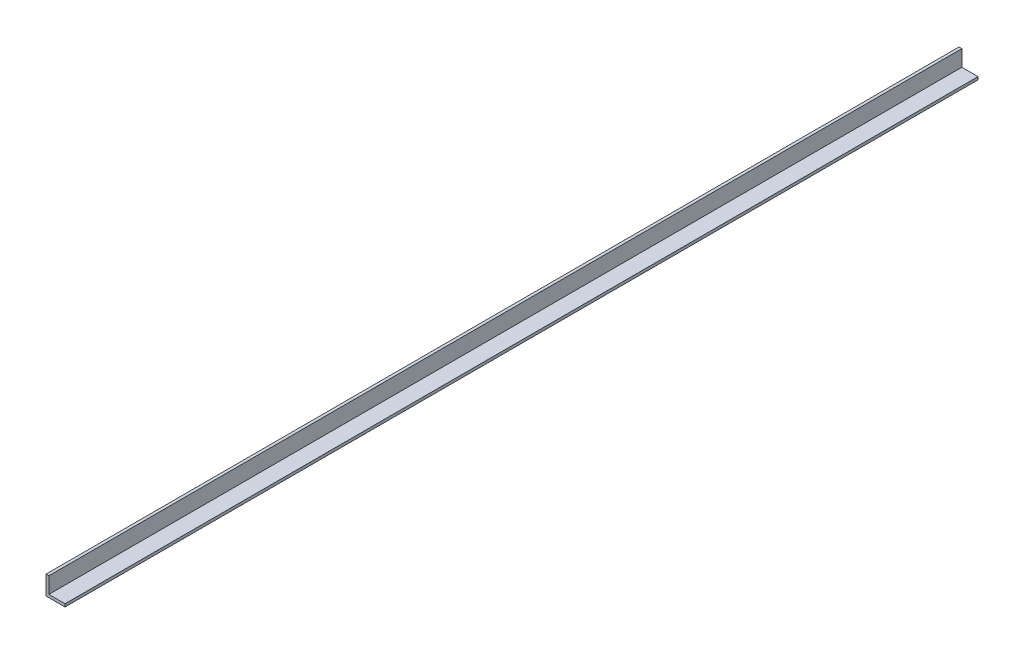
ISO-10303-21;
HEADER;
FILE_DESCRIPTION(('STEP AP214'),'2;1');
FILE_NAME('part.step','',(''),(''),'','','');
FILE_SCHEMA(('AUTOMOTIVE_DESIGN { 1 0 10303 214 1 1 1 1 }'));
ENDSEC;
DATA;
#1=APPLICATION_CONTEXT('core data for automotive mechanical design processes');
#2=APPLICATION_PROTOCOL_DEFINITION('international standard','automotive_design',2000,#1);
#3=PRODUCT_CONTEXT('',#1,'mechanical');
#4=PRODUCT('Part','Part','',(#3));
#5=PRODUCT_RELATED_PRODUCT_CATEGORY('part','',(#4));
#6=PRODUCT_DEFINITION_FORMATION('','',#4);
#7=PRODUCT_DEFINITION_CONTEXT('part definition',#1,'design');
#8=PRODUCT_DEFINITION('design','',#6,#7);
#9=PRODUCT_DEFINITION_SHAPE('','',#8);
#10=(LENGTH_UNIT() NAMED_UNIT(*) SI_UNIT(.MILLI.,.METRE.));
#11=(NAMED_UNIT(*) PLANE_ANGLE_UNIT() SI_UNIT($,.RADIAN.));
#12=(NAMED_UNIT(*) SI_UNIT($,.STERADIAN.) SOLID_ANGLE_UNIT());
#13=UNCERTAINTY_MEASURE_WITH_UNIT(LENGTH_MEASURE(1.E-05),#10,'distance_accuracy_value','');
#14=(GEOMETRIC_REPRESENTATION_CONTEXT(3) GLOBAL_UNCERTAINTY_ASSIGNED_CONTEXT((#13)) GLOBAL_UNIT_ASSIGNED_CONTEXT((#10,
#11,#12)) REPRESENTATION_CONTEXT('',''));
#15=CARTESIAN_POINT('',(0.,0.,0.));
#16=DIRECTION('',(0.,0.,1.));
#17=DIRECTION('',(1.,0.,0.));
#18=AXIS2_PLACEMENT_3D('',#15,#16,#17);
#19=CARTESIAN_POINT('',(19.05,127.,-6100.));
#20=DIRECTION('',(0.,1.,0.));
#21=DIRECTION('',(0.,0.,1.));
#22=AXIS2_PLACEMENT_3D('',#19,#20,#21);
#23=PLANE('',#22);
#24=DIRECTION('',(-1.,0.,0.));
#25=VECTOR('',#24,1.);
#26=CARTESIAN_POINT('',(19.05,127.,0.));
#27=LINE('',#26,#25);
#28=CARTESIAN_POINT('',(19.05,127.,0.));
#29=VERTEX_POINT('',#28);
#30=CARTESIAN_POINT('',(0.,127.,0.));
#31=VERTEX_POINT('',#30);
#32=EDGE_CURVE('E118',#29,#31,#27,.T.);
#33=ORIENTED_EDGE('',*,*,#32,.F.);
#34=DIRECTION('',(0.,0.,1.));
#35=VECTOR('',#34,1.);
#36=CARTESIAN_POINT('',(19.05,127.,-6100.));
#37=LINE('',#36,#35);
#38=CARTESIAN_POINT('',(19.05,127.,-6100.));
#39=VERTEX_POINT('',#38);
#40=EDGE_CURVE('E11',#39,#29,#37,.T.);
#41=ORIENTED_EDGE('',*,*,#40,.F.);
#42=DIRECTION('',(-1.,0.,0.));
#43=VECTOR('',#42,1.);
#44=CARTESIAN_POINT('',(19.05,127.,-6100.));
#45=LINE('',#44,#43);
#46=CARTESIAN_POINT('',(0.,127.,-6100.));
#47=VERTEX_POINT('',#46);
#48=EDGE_CURVE('E132',#39,#47,#45,.T.);
#49=ORIENTED_EDGE('',*,*,#48,.T.);
#50=DIRECTION('',(0.,0.,1.));
#51=VECTOR('',#50,1.);
#52=CARTESIAN_POINT('',(0.,127.,-6100.));
#53=LINE('',#52,#51);
#54=EDGE_CURVE('E36',#47,#31,#53,.T.);
#55=ORIENTED_EDGE('',*,*,#54,.T.);
#56=EDGE_LOOP('',(#33,#41,#49,#55));
#57=FACE_BOUND('',#56,.T.);
#58=ADVANCED_FACE('F33',(#57),#23,.T.);
#59=CARTESIAN_POINT('',(19.05,19.05,-6100.));
#60=DIRECTION('',(1.,0.,0.));
#61=DIRECTION('',(0.,0.,-1.));
#62=AXIS2_PLACEMENT_3D('',#59,#60,#61);
#63=PLANE('',#62);
#64=DIRECTION('',(0.,1.,0.));
#65=VECTOR('',#64,1.);
#66=CARTESIAN_POINT('',(19.05,19.05,0.));
#67=LINE('',#66,#65);
#68=CARTESIAN_POINT('',(19.05,19.05,0.));
#69=VERTEX_POINT('',#68);
#70=EDGE_CURVE('E130',#69,#29,#67,.T.);
#71=ORIENTED_EDGE('',*,*,#70,.F.);
#72=DIRECTION('',(0.,0.,1.));
#73=VECTOR('',#72,1.);
#74=CARTESIAN_POINT('',(19.05,19.05,-6100.));
#75=LINE('',#74,#73);
#76=CARTESIAN_POINT('',(19.05,19.05,-6100.));
#77=VERTEX_POINT('',#76);
#78=EDGE_CURVE('E42',#77,#69,#75,.T.);
#79=ORIENTED_EDGE('',*,*,#78,.F.);
#80=DIRECTION('',(0.,1.,0.));
#81=VECTOR('',#80,1.);
#82=CARTESIAN_POINT('',(19.05,19.05,-6100.));
#83=LINE('',#82,#81);
#84=EDGE_CURVE('E108',#77,#39,#83,.T.);
#85=ORIENTED_EDGE('',*,*,#84,.T.);
#86=ORIENTED_EDGE('',*,*,#40,.T.);
#87=EDGE_LOOP('',(#71,#79,#85,#86));
#88=FACE_BOUND('',#87,.T.);
#89=ADVANCED_FACE('F140',(#88),#63,.T.);
#90=CARTESIAN_POINT('',(127.,19.05,-6100.));
#91=DIRECTION('',(0.,1.,0.));
#92=DIRECTION('',(-1.,0.,0.));
#93=AXIS2_PLACEMENT_3D('',#90,#91,#92);
#94=PLANE('',#93);
#95=DIRECTION('',(-1.,0.,0.));
#96=VECTOR('',#95,1.);
#97=CARTESIAN_POINT('',(127.,19.05,0.));
#98=LINE('',#97,#96);
#99=CARTESIAN_POINT('',(127.,19.05,0.));
#100=VERTEX_POINT('',#99);
#101=EDGE_CURVE('E95',#100,#69,#98,.T.);
#102=ORIENTED_EDGE('',*,*,#101,.F.);
#103=DIRECTION('',(0.,0.,1.));
#104=VECTOR('',#103,1.);
#105=CARTESIAN_POINT('',(127.,19.05,-6100.));
#106=LINE('',#105,#104);
#107=CARTESIAN_POINT('',(127.,19.05,-6100.));
#108=VERTEX_POINT('',#107);
#109=EDGE_CURVE('E90',#108,#100,#106,.T.);
#110=ORIENTED_EDGE('',*,*,#109,.F.);
#111=DIRECTION('',(-1.,0.,0.));
#112=VECTOR('',#111,1.);
#113=CARTESIAN_POINT('',(127.,19.05,-6100.));
#114=LINE('',#113,#112);
#115=EDGE_CURVE('E93',#108,#77,#114,.T.);
#116=ORIENTED_EDGE('',*,*,#115,.T.);
#117=ORIENTED_EDGE('',*,*,#78,.T.);
#118=EDGE_LOOP('',(#102,#110,#116,#117));
#119=FACE_BOUND('',#118,.T.);
#120=ADVANCED_FACE('F92',(#119),#94,.T.);
#121=CARTESIAN_POINT('',(127.,0.,-6100.));
#122=DIRECTION('',(1.,0.,0.));
#123=DIRECTION('',(0.,0.,-1.));
#124=AXIS2_PLACEMENT_3D('',#121,#122,#123);
#125=PLANE('',#124);
#126=DIRECTION('',(0.,1.,0.));
#127=VECTOR('',#126,1.);
#128=CARTESIAN_POINT('',(127.,0.,0.));
#129=LINE('',#128,#127);
#130=CARTESIAN_POINT('',(127.,0.,0.));
#131=VERTEX_POINT('',#130);
#132=EDGE_CURVE('E127',#131,#100,#129,.T.);
#133=ORIENTED_EDGE('',*,*,#132,.F.);
#134=DIRECTION('',(0.,0.,1.));
#135=VECTOR('',#134,1.);
#136=CARTESIAN_POINT('',(127.,0.,-6100.));
#137=LINE('',#136,#135);
#138=CARTESIAN_POINT('',(127.,0.,-6100.));
#139=VERTEX_POINT('',#138);
#140=EDGE_CURVE('E100',#139,#131,#137,.T.);
#141=ORIENTED_EDGE('',*,*,#140,.F.);
#142=DIRECTION('',(0.,1.,0.));
#143=VECTOR('',#142,1.);
#144=CARTESIAN_POINT('',(127.,0.,-6100.));
#145=LINE('',#144,#143);
#146=EDGE_CURVE('E106',#139,#108,#145,.T.);
#147=ORIENTED_EDGE('',*,*,#146,.T.);
#148=ORIENTED_EDGE('',*,*,#109,.T.);
#149=EDGE_LOOP('',(#133,#141,#147,#148));
#150=FACE_BOUND('',#149,.T.);
#151=ADVANCED_FACE('F110',(#150),#125,.T.);
#152=CARTESIAN_POINT('',(0.,0.,-6100.));
#153=DIRECTION('',(0.,-1.,0.));
#154=DIRECTION('',(0.,0.,-1.));
#155=AXIS2_PLACEMENT_3D('',#152,#153,#154);
#156=PLANE('',#155);
#157=DIRECTION('',(1.,0.,0.));
#158=VECTOR('',#157,1.);
#159=CARTESIAN_POINT('',(0.,0.,0.));
#160=LINE('',#159,#158);
#161=CARTESIAN_POINT('',(0.,0.,0.));
#162=VERTEX_POINT('',#161);
#163=EDGE_CURVE('E124',#162,#131,#160,.T.);
#164=ORIENTED_EDGE('',*,*,#163,.F.);
#165=DIRECTION('',(0.,0.,1.));
#166=VECTOR('',#165,1.);
#167=CARTESIAN_POINT('',(0.,0.,-6100.));
#168=LINE('',#167,#166);
#169=CARTESIAN_POINT('',(0.,0.,-6100.));
#170=VERTEX_POINT('',#169);
#171=EDGE_CURVE('E135',#170,#162,#168,.T.);
#172=ORIENTED_EDGE('',*,*,#171,.F.);
#173=DIRECTION('',(1.,0.,0.));
#174=VECTOR('',#173,1.);
#175=CARTESIAN_POINT('',(0.,0.,-6100.));
#176=LINE('',#175,#174);
#177=EDGE_CURVE('E111',#170,#139,#176,.T.);
#178=ORIENTED_EDGE('',*,*,#177,.T.);
#179=ORIENTED_EDGE('',*,*,#140,.T.);
#180=EDGE_LOOP('',(#164,#172,#178,#179));
#181=FACE_BOUND('',#180,.T.);
#182=ADVANCED_FACE('F153',(#181),#156,.T.);
#183=CARTESIAN_POINT('',(0.,127.,-6100.));
#184=DIRECTION('',(-1.,0.,0.));
#185=DIRECTION('',(0.,-1.,0.));
#186=AXIS2_PLACEMENT_3D('',#183,#184,#185);
#187=PLANE('',#186);
#188=DIRECTION('',(0.,-1.,0.));
#189=VECTOR('',#188,1.);
#190=CARTESIAN_POINT('',(0.,127.,0.));
#191=LINE('',#190,#189);
#192=EDGE_CURVE('E121',#31,#162,#191,.T.);
#193=ORIENTED_EDGE('',*,*,#192,.F.);
#194=ORIENTED_EDGE('',*,*,#54,.F.);
#195=DIRECTION('',(0.,-1.,0.));
#196=VECTOR('',#195,1.);
#197=CARTESIAN_POINT('',(0.,127.,-6100.));
#198=LINE('',#197,#196);
#199=EDGE_CURVE('E113',#47,#170,#198,.T.);
#200=ORIENTED_EDGE('',*,*,#199,.T.);
#201=ORIENTED_EDGE('',*,*,#171,.T.);
#202=EDGE_LOOP('',(#193,#194,#200,#201));
#203=FACE_BOUND('',#202,.T.);
#204=ADVANCED_FACE('F137',(#203),#187,.T.);
#205=CARTESIAN_POINT('',(0.,0.,-6100.));
#206=DIRECTION('',(0.,0.,1.));
#207=DIRECTION('',(1.,0.,0.));
#208=AXIS2_PLACEMENT_3D('',#205,#206,#207);
#209=PLANE('',#208);
#210=ORIENTED_EDGE('',*,*,#48,.F.);
#211=ORIENTED_EDGE('',*,*,#84,.F.);
#212=ORIENTED_EDGE('',*,*,#115,.F.);
#213=ORIENTED_EDGE('',*,*,#146,.F.);
#214=ORIENTED_EDGE('',*,*,#177,.F.);
#215=ORIENTED_EDGE('',*,*,#199,.F.);
#216=EDGE_LOOP('',(#210,#211,#212,#213,#214,#215));
#217=FACE_BOUND('',#216,.T.);
#218=ADVANCED_FACE('F104',(#217),#209,.F.);
#219=CARTESIAN_POINT('',(0.,0.,0.));
#220=DIRECTION('',(0.,0.,1.));
#221=DIRECTION('',(1.,0.,0.));
#222=AXIS2_PLACEMENT_3D('',#219,#220,#221);
#223=PLANE('',#222);
#224=ORIENTED_EDGE('',*,*,#32,.T.);
#225=ORIENTED_EDGE('',*,*,#192,.T.);
#226=ORIENTED_EDGE('',*,*,#163,.T.);
#227=ORIENTED_EDGE('',*,*,#132,.T.);
#228=ORIENTED_EDGE('',*,*,#101,.T.);
#229=ORIENTED_EDGE('',*,*,#70,.T.);
#230=EDGE_LOOP('',(#224,#225,#226,#227,#228,#229));
#231=FACE_BOUND('',#230,.T.);
#232=ADVANCED_FACE('F139',(#231),#223,.T.);
#233=CLOSED_SHELL('',(#58,#89,#120,#151,#182,#204,#218,#232));
#234=MANIFOLD_SOLID_BREP('B2',#233);
#235=ADVANCED_BREP_SHAPE_REPRESENTATION('',(#18,#234),#14);
#236=SHAPE_DEFINITION_REPRESENTATION(#9,#235);
ENDSEC;
END-ISO-10303-21;
